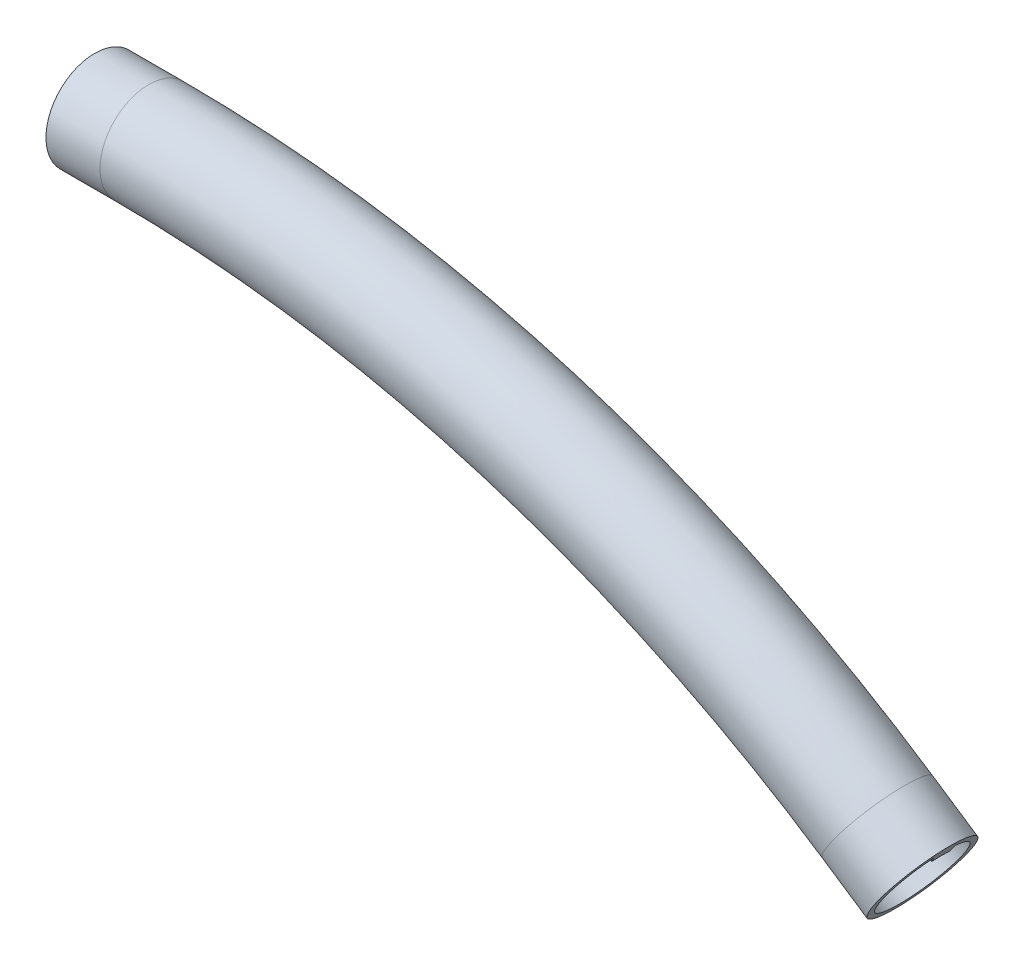
ISO-10303-21;
HEADER;
FILE_DESCRIPTION(('STEP AP214'),'2;1');
FILE_NAME('part.step','',(''),(''),'','','');
FILE_SCHEMA(('AUTOMOTIVE_DESIGN { 1 0 10303 214 1 1 1 1 }'));
ENDSEC;
DATA;
#1=APPLICATION_CONTEXT('core data for automotive mechanical design processes');
#2=APPLICATION_PROTOCOL_DEFINITION('international standard','automotive_design',2000,#1);
#3=PRODUCT_CONTEXT('',#1,'mechanical');
#4=PRODUCT('Part','Part','',(#3));
#5=PRODUCT_RELATED_PRODUCT_CATEGORY('part','',(#4));
#6=PRODUCT_DEFINITION_FORMATION('','',#4);
#7=PRODUCT_DEFINITION_CONTEXT('part definition',#1,'design');
#8=PRODUCT_DEFINITION('design','',#6,#7);
#9=PRODUCT_DEFINITION_SHAPE('','',#8);
#10=(LENGTH_UNIT() NAMED_UNIT(*) SI_UNIT(.MILLI.,.METRE.));
#11=(NAMED_UNIT(*) PLANE_ANGLE_UNIT() SI_UNIT($,.RADIAN.));
#12=(NAMED_UNIT(*) SI_UNIT($,.STERADIAN.) SOLID_ANGLE_UNIT());
#13=UNCERTAINTY_MEASURE_WITH_UNIT(LENGTH_MEASURE(1.E-05),#10,'distance_accuracy_value','');
#14=(GEOMETRIC_REPRESENTATION_CONTEXT(3) GLOBAL_UNCERTAINTY_ASSIGNED_CONTEXT((#13)) GLOBAL_UNIT_ASSIGNED_CONTEXT((#10,
#11,#12)) REPRESENTATION_CONTEXT('',''));
#15=CARTESIAN_POINT('',(0.,0.,0.));
#16=DIRECTION('',(0.,0.,1.));
#17=DIRECTION('',(1.,0.,0.));
#18=AXIS2_PLACEMENT_3D('',#15,#16,#17);
#19=CARTESIAN_POINT('',(10.,100.,0.));
#20=DIRECTION('',(-1.,0.,0.));
#21=DIRECTION('',(0.,0.,1.));
#22=AXIS2_PLACEMENT_3D('',#19,#20,#21);
#23=CYLINDRICAL_SURFACE('',#22,7.75);
#24=CARTESIAN_POINT('',(10.,100.,0.));
#25=DIRECTION('',(1.,0.,0.));
#26=DIRECTION('',(0.,0.,-1.));
#27=AXIS2_PLACEMENT_3D('',#24,#25,#26);
#28=CIRCLE('',#27,7.75);
#29=CARTESIAN_POINT('',(10.,107.75,0.));
#30=VERTEX_POINT('',#29);
#31=EDGE_CURVE('E154',#30,#30,#28,.T.);
#32=ORIENTED_EDGE('',*,*,#31,.T.);
#33=EDGE_LOOP('',(#32));
#34=FACE_BOUND('',#33,.T.);
#35=CARTESIAN_POINT('',(0.,100.,0.));
#36=DIRECTION('',(1.,0.,0.));
#37=DIRECTION('',(0.,0.,-1.));
#38=AXIS2_PLACEMENT_3D('',#35,#36,#37);
#39=CIRCLE('',#38,7.75);
#40=CARTESIAN_POINT('',(0.,107.48592515374,2.00584759954462));
#41=VERTEX_POINT('',#40);
#42=CARTESIAN_POINT('',(0.,107.48592515374,-2.00584759954446));
#43=VERTEX_POINT('',#42);
#44=EDGE_CURVE('E148',#41,#43,#39,.T.);
#45=ORIENTED_EDGE('',*,*,#44,.F.);
#46=DIRECTION('',(-1.,0.,0.));
#47=VECTOR('',#46,1.);
#48=CARTESIAN_POINT('',(5.,107.48592515374,2.00584759954462));
#49=LINE('',#48,#47);
#50=CARTESIAN_POINT('',(5.,107.48592515374,2.00584759954462));
#51=VERTEX_POINT('',#50);
#52=EDGE_CURVE('E325',#51,#41,#49,.T.);
#53=ORIENTED_EDGE('',*,*,#52,.F.);
#54=CARTESIAN_POINT('',(5.,99.9999999999999,0.));
#55=DIRECTION('',(-1.,0.,0.));
#56=DIRECTION('',(0.,0.,1.));
#57=AXIS2_PLACEMENT_3D('',#54,#55,#56);
#58=CIRCLE('',#57,7.75000000000011);
#59=CARTESIAN_POINT('',(5.,107.48592515374,-2.00584759954446));
#60=VERTEX_POINT('',#59);
#61=EDGE_CURVE('E114',#51,#60,#58,.T.);
#62=ORIENTED_EDGE('',*,*,#61,.T.);
#63=DIRECTION('',(-1.,0.,0.));
#64=VECTOR('',#63,1.);
#65=CARTESIAN_POINT('',(5.,107.48592515374,-2.00584759954446));
#66=LINE('',#65,#64);
#67=EDGE_CURVE('E125',#60,#43,#66,.T.);
#68=ORIENTED_EDGE('',*,*,#67,.T.);
#69=EDGE_LOOP('',(#45,#53,#62,#68));
#70=FACE_BOUND('',#69,.T.);
#71=ADVANCED_FACE('F33',(#34,#70),#23,.F.);
#72=CARTESIAN_POINT('',(144.795757594128,59.1101539694819,0.));
#73=DIRECTION('',(0.831469612302545,-0.555570233019603,0.));
#74=DIRECTION('',(0.555570233019603,0.831469612302545,0.));
#75=AXIS2_PLACEMENT_3D('',#72,#73,#74);
#76=CYLINDRICAL_SURFACE('',#75,9.);
#77=CARTESIAN_POINT('',(144.795757594128,59.1101539694819,0.));
#78=DIRECTION('',(0.831469612302544,-0.555570233019603,0.));
#79=DIRECTION('',(0.,0.,-1.));
#80=AXIS2_PLACEMENT_3D('',#77,#78,#79);
#81=CIRCLE('',#80,9.);
#82=CARTESIAN_POINT('',(149.795889691304,66.5933804802048,0.));
#83=VERTEX_POINT('',#82);
#84=EDGE_CURVE('E167',#83,#83,#81,.T.);
#85=ORIENTED_EDGE('',*,*,#84,.T.);
#86=EDGE_LOOP('',(#85));
#87=FACE_BOUND('',#86,.T.);
#88=CARTESIAN_POINT('',(153.110453717153,53.5544516392859,0.));
#89=DIRECTION('',(0.831469612302544,-0.555570233019603,0.));
#90=DIRECTION('',(0.,0.,-1.));
#91=AXIS2_PLACEMENT_3D('',#88,#89,#90);
#92=CIRCLE('',#91,9.);
#93=CARTESIAN_POINT('',(153.110453717153,53.5544516392859,-9.));
#94=VERTEX_POINT('',#93);
#95=EDGE_CURVE('E11',#94,#94,#92,.T.);
#96=ORIENTED_EDGE('',*,*,#95,.F.);
#97=EDGE_LOOP('',(#96));
#98=FACE_BOUND('',#97,.T.);
#99=ADVANCED_FACE('F35',(#87,#98),#76,.T.);
#100=CARTESIAN_POINT('',(144.795757594128,59.1101539694819,0.));
#101=DIRECTION('',(0.831469612302545,-0.555570233019603,0.));
#102=DIRECTION('',(0.555570233019603,0.831469612302545,0.));
#103=AXIS2_PLACEMENT_3D('',#100,#101,#102);
#104=CYLINDRICAL_SURFACE('',#103,7.75);
#105=CARTESIAN_POINT('',(144.795757594128,59.1101539694819,0.));
#106=DIRECTION('',(0.831469612302544,-0.555570233019603,0.));
#107=DIRECTION('',(0.,0.,-1.));
#108=AXIS2_PLACEMENT_3D('',#105,#106,#107);
#109=CIRCLE('',#108,7.75);
#110=CARTESIAN_POINT('',(149.10142690003,65.5540434648267,0.));
#111=VERTEX_POINT('',#110);
#112=EDGE_CURVE('E161',#111,#111,#109,.T.);
#113=ORIENTED_EDGE('',*,*,#112,.F.);
#114=EDGE_LOOP('',(#113));
#115=FACE_BOUND('',#114,.T.);
#116=CARTESIAN_POINT('',(148.953105655641,56.3323028043838,0.));
#117=DIRECTION('',(0.831469612302544,-0.555570233019603,0.));
#118=DIRECTION('',(0.555570233019603,0.831469612302544,0.));
#119=AXIS2_PLACEMENT_3D('',#116,#117,#118);
#120=CIRCLE('',#119,7.75000000000014);
#121=CARTESIAN_POINT('',(153.112062837672,62.5566220896902,-2.00584759954454));
#122=VERTEX_POINT('',#121);
#123=CARTESIAN_POINT('',(153.112062837672,62.5566220896902,2.00584759954455));
#124=VERTEX_POINT('',#123);
#125=EDGE_CURVE('E136',#122,#124,#120,.T.);
#126=ORIENTED_EDGE('',*,*,#125,.T.);
#127=DIRECTION('',(0.831469612302544,-0.555570233019603,0.));
#128=VECTOR('',#127,1.);
#129=CARTESIAN_POINT('',(153.112062837672,62.5566220896902,2.00584759954455));
#130=LINE('',#129,#128);
#131=CARTESIAN_POINT('',(157.269410899184,59.7787709245922,2.00584759954455));
#132=VERTEX_POINT('',#131);
#133=EDGE_CURVE('E149',#124,#132,#130,.T.);
#134=ORIENTED_EDGE('',*,*,#133,.T.);
#135=CARTESIAN_POINT('',(153.110453717153,53.5544516392859,0.));
#136=DIRECTION('',(0.831469612302544,-0.555570233019603,0.));
#137=DIRECTION('',(0.,0.,-1.));
#138=AXIS2_PLACEMENT_3D('',#135,#136,#137);
#139=CIRCLE('',#138,7.75);
#140=CARTESIAN_POINT('',(157.269410899184,59.7787709245922,-2.00584759954454));
#141=VERTEX_POINT('',#140);
#142=EDGE_CURVE('E41',#132,#141,#139,.T.);
#143=ORIENTED_EDGE('',*,*,#142,.T.);
#144=DIRECTION('',(0.831469612302544,-0.555570233019603,0.));
#145=VECTOR('',#144,1.);
#146=CARTESIAN_POINT('',(153.112062837672,62.5566220896902,-2.00584759954454));
#147=LINE('',#146,#145);
#148=EDGE_CURVE('E56',#122,#141,#147,.T.);
#149=ORIENTED_EDGE('',*,*,#148,.F.);
#150=EDGE_LOOP('',(#126,#134,#143,#149));
#151=FACE_BOUND('',#150,.T.);
#152=ADVANCED_FACE('F169',(#115,#151),#104,.F.);
#153=CARTESIAN_POINT('',(10.,-142.62595362875,0.));
#154=DIRECTION('',(0.,0.,-1.));
#155=DIRECTION('',(-1.,0.,0.));
#156=AXIS2_PLACEMENT_3D('',#153,#154,#155);
#157=TOROIDAL_SURFACE('',#156,242.62595362875,9.);
#158=CARTESIAN_POINT('',(10.,100.,0.));
#159=DIRECTION('',(1.,0.,0.));
#160=DIRECTION('',(0.,0.,-1.));
#161=AXIS2_PLACEMENT_3D('',#158,#159,#160);
#162=CIRCLE('',#161,9.);
#163=CARTESIAN_POINT('',(10.,109.,0.));
#164=VERTEX_POINT('',#163);
#165=EDGE_CURVE('E157',#164,#164,#162,.T.);
#166=CARTESIAN_POINT('',(10.,-142.62595362875,0.));
#167=DIRECTION('',(0.,0.,-1.));
#168=DIRECTION('',(-1.,0.,0.));
#169=AXIS2_PLACEMENT_3D('',#166,#167,#168);
#170=CIRCLE('',#169,251.62595362875);
#171=EDGE_CURVE('',#164,#83,#170,.T.);
#172=ORIENTED_EDGE('',*,*,#165,.T.);
#173=ORIENTED_EDGE('',*,*,#84,.F.);
#174=ORIENTED_EDGE('',*,*,#171,.T.);
#175=ORIENTED_EDGE('',*,*,#171,.F.);
#176=EDGE_LOOP('',(#172,#174,#173,#175));
#177=FACE_BOUND('',#176,.T.);
#178=ADVANCED_FACE('F213',(#177),#157,.T.);
#179=CARTESIAN_POINT('',(10.,-142.62595362875,0.));
#180=DIRECTION('',(0.,0.,-1.));
#181=DIRECTION('',(-1.,0.,0.));
#182=AXIS2_PLACEMENT_3D('',#179,#180,#181);
#183=TOROIDAL_SURFACE('',#182,242.62595362875,7.75);
#184=CARTESIAN_POINT('',(10.,-142.62595362875,0.));
#185=DIRECTION('',(0.,0.,-1.));
#186=DIRECTION('',(-1.,0.,0.));
#187=AXIS2_PLACEMENT_3D('',#184,#185,#186);
#188=CIRCLE('',#187,250.37595362875);
#189=EDGE_CURVE('',#30,#111,#188,.T.);
#190=ORIENTED_EDGE('',*,*,#31,.F.);
#191=ORIENTED_EDGE('',*,*,#112,.T.);
#192=ORIENTED_EDGE('',*,*,#189,.T.);
#193=ORIENTED_EDGE('',*,*,#189,.F.);
#194=EDGE_LOOP('',(#190,#192,#191,#193));
#195=FACE_BOUND('',#194,.T.);
#196=ADVANCED_FACE('F210',(#195),#183,.F.);
#197=CARTESIAN_POINT('',(10.,100.,0.));
#198=DIRECTION('',(-1.,0.,0.));
#199=DIRECTION('',(0.,0.,1.));
#200=AXIS2_PLACEMENT_3D('',#197,#198,#199);
#201=CYLINDRICAL_SURFACE('',#200,9.);
#202=ORIENTED_EDGE('',*,*,#165,.F.);
#203=EDGE_LOOP('',(#202));
#204=FACE_BOUND('',#203,.T.);
#205=CARTESIAN_POINT('',(0.,100.,0.));
#206=DIRECTION('',(1.,0.,0.));
#207=DIRECTION('',(0.,0.,-1.));
#208=AXIS2_PLACEMENT_3D('',#205,#206,#207);
#209=CIRCLE('',#208,9.);
#210=CARTESIAN_POINT('',(0.,100.,-9.));
#211=VERTEX_POINT('',#210);
#212=EDGE_CURVE('E158',#211,#211,#209,.T.);
#213=ORIENTED_EDGE('',*,*,#212,.T.);
#214=EDGE_LOOP('',(#213));
#215=FACE_BOUND('',#214,.T.);
#216=ADVANCED_FACE('F208',(#204,#215),#201,.T.);
#217=CARTESIAN_POINT('',(153.110453717153,53.5544516392859,0.));
#218=DIRECTION('',(0.831469612302544,-0.555570233019603,0.));
#219=DIRECTION('',(0.,0.,-1.));
#220=AXIS2_PLACEMENT_3D('',#217,#218,#219);
#221=PLANE('',#220);
#222=ORIENTED_EDGE('',*,*,#142,.F.);
#223=DIRECTION('',(-0.536639636391071,-0.803137972297589,-0.258819045102514));
#224=VECTOR('',#223,1.);
#225=CARTESIAN_POINT('',(156.464451444598,58.5740639661458,1.61761903189077));
#226=LINE('',#225,#224);
#227=CARTESIAN_POINT('',(156.464451444598,58.5740639661458,1.61761903189077));
#228=VERTEX_POINT('',#227);
#229=EDGE_CURVE('E133',#132,#228,#226,.T.);
#230=ORIENTED_EDGE('',*,*,#229,.T.);
#231=CARTESIAN_POINT('',(153.110453717153,53.5544516392858,0.));
#232=DIRECTION('',(-0.831469612302544,0.555570233019603,0.));
#233=DIRECTION('',(0.555570233019603,0.831469612302544,0.));
#234=AXIS2_PLACEMENT_3D('',#231,#232,#233);
#235=CIRCLE('',#234,6.25000000000013);
#236=CARTESIAN_POINT('',(156.464451444598,58.5740639661458,-1.61761903189077));
#237=VERTEX_POINT('',#236);
#238=EDGE_CURVE('E120',#228,#237,#235,.T.);
#239=ORIENTED_EDGE('',*,*,#238,.T.);
#240=DIRECTION('',(0.53663963639107,0.803137972297588,-0.258819045102518));
#241=VECTOR('',#240,1.);
#242=CARTESIAN_POINT('',(157.269410899184,59.7787709245922,-2.00584759954455));
#243=LINE('',#242,#241);
#244=EDGE_CURVE('E123',#237,#141,#243,.T.);
#245=ORIENTED_EDGE('',*,*,#244,.T.);
#246=EDGE_LOOP('',(#222,#230,#239,#245));
#247=FACE_BOUND('',#246,.T.);
#248=ORIENTED_EDGE('',*,*,#95,.T.);
#249=EDGE_LOOP('',(#248));
#250=FACE_BOUND('',#249,.T.);
#251=ADVANCED_FACE('F177',(#247,#250),#221,.T.);
#252=CARTESIAN_POINT('',(0.,100.,0.));
#253=DIRECTION('',(1.,0.,0.));
#254=DIRECTION('',(0.,0.,-1.));
#255=AXIS2_PLACEMENT_3D('',#252,#253,#254);
#256=PLANE('',#255);
#257=ORIENTED_EDGE('',*,*,#44,.T.);
#258=DIRECTION('',(0.,0.96592582628907,-0.258819045102515));
#259=VECTOR('',#258,1.);
#260=CARTESIAN_POINT('',(0.,106.037036414307,-1.61761903189069));
#261=LINE('',#260,#259);
#262=CARTESIAN_POINT('',(0.,106.037036414307,-1.61761903189069));
#263=VERTEX_POINT('',#262);
#264=EDGE_CURVE('E117',#263,#43,#261,.T.);
#265=ORIENTED_EDGE('',*,*,#264,.F.);
#266=CARTESIAN_POINT('',(0.,99.9999999999999,0.));
#267=DIRECTION('',(-1.,0.,0.));
#268=DIRECTION('',(0.,0.,1.));
#269=AXIS2_PLACEMENT_3D('',#266,#267,#268);
#270=CIRCLE('',#269,6.25000000000009);
#271=CARTESIAN_POINT('',(0.,106.037036414307,1.61761903189083));
#272=VERTEX_POINT('',#271);
#273=EDGE_CURVE('E322',#272,#263,#270,.T.);
#274=ORIENTED_EDGE('',*,*,#273,.F.);
#275=DIRECTION('',(0.,-0.965925826289069,-0.25881904510252));
#276=VECTOR('',#275,1.);
#277=CARTESIAN_POINT('',(0.,107.48592515374,2.00584759954462));
#278=LINE('',#277,#276);
#279=EDGE_CURVE('E48',#41,#272,#278,.T.);
#280=ORIENTED_EDGE('',*,*,#279,.F.);
#281=EDGE_LOOP('',(#257,#265,#274,#280));
#282=FACE_BOUND('',#281,.T.);
#283=ORIENTED_EDGE('',*,*,#212,.F.);
#284=EDGE_LOOP('',(#283));
#285=FACE_BOUND('',#284,.T.);
#286=ADVANCED_FACE('F195',(#282,#285),#256,.F.);
#287=CARTESIAN_POINT('',(148.953105655641,56.3323028043838,0.));
#288=DIRECTION('',(0.831469612302544,-0.555570233019603,0.));
#289=DIRECTION('',(0.555570233019604,0.831469612302545,0.));
#290=AXIS2_PLACEMENT_3D('',#287,#288,#289);
#291=CYLINDRICAL_SURFACE('',#290,6.25000000000013);
#292=ORIENTED_EDGE('',*,*,#238,.F.);
#293=DIRECTION('',(0.831469612302544,-0.555570233019603,0.));
#294=VECTOR('',#293,1.);
#295=CARTESIAN_POINT('',(152.307103383085,61.3519151312438,1.61761903189077));
#296=LINE('',#295,#294);
#297=CARTESIAN_POINT('',(152.307103383085,61.3519151312438,1.61761903189077));
#298=VERTEX_POINT('',#297);
#299=EDGE_CURVE('E146',#298,#228,#296,.T.);
#300=ORIENTED_EDGE('',*,*,#299,.F.);
#301=CARTESIAN_POINT('',(148.953105655641,56.3323028043838,0.));
#302=DIRECTION('',(-0.831469612302544,0.555570233019603,0.));
#303=DIRECTION('',(0.555570233019603,0.831469612302544,0.));
#304=AXIS2_PLACEMENT_3D('',#301,#302,#303);
#305=CIRCLE('',#304,6.25000000000013);
#306=CARTESIAN_POINT('',(152.307103383085,61.3519151312438,-1.61761903189077));
#307=VERTEX_POINT('',#306);
#308=EDGE_CURVE('E129',#298,#307,#305,.T.);
#309=ORIENTED_EDGE('',*,*,#308,.T.);
#310=DIRECTION('',(0.831469612302544,-0.555570233019603,0.));
#311=VECTOR('',#310,1.);
#312=CARTESIAN_POINT('',(152.307103383085,61.3519151312438,-1.61761903189077));
#313=LINE('',#312,#311);
#314=EDGE_CURVE('E140',#307,#237,#313,.T.);
#315=ORIENTED_EDGE('',*,*,#314,.T.);
#316=EDGE_LOOP('',(#292,#300,#309,#315));
#317=FACE_BOUND('',#316,.T.);
#318=ADVANCED_FACE('F181',(#317),#291,.F.);
#319=CARTESIAN_POINT('',(152.307103383085,61.3519151312438,1.61761903189077));
#320=DIRECTION('',(-0.143792157197515,-0.215200171087902,0.96592582628907));
#321=DIRECTION('',(0.,-0.976069225530008,-0.217460035347303));
#322=AXIS2_PLACEMENT_3D('',#319,#320,#321);
#323=PLANE('',#322);
#324=ORIENTED_EDGE('',*,*,#229,.F.);
#325=ORIENTED_EDGE('',*,*,#133,.F.);
#326=DIRECTION('',(-0.536639636391071,-0.803137972297589,-0.258819045102514));
#327=VECTOR('',#326,1.);
#328=CARTESIAN_POINT('',(152.307103383085,61.3519151312438,1.61761903189077));
#329=LINE('',#328,#327);
#330=EDGE_CURVE('E138',#124,#298,#329,.T.);
#331=ORIENTED_EDGE('',*,*,#330,.T.);
#332=ORIENTED_EDGE('',*,*,#299,.T.);
#333=EDGE_LOOP('',(#324,#325,#331,#332));
#334=FACE_BOUND('',#333,.T.);
#335=ADVANCED_FACE('F187',(#334),#323,.T.);
#336=CARTESIAN_POINT('',(153.112062837672,62.5566220896902,-2.00584759954455));
#337=DIRECTION('',(-0.143792157197517,-0.215200171087905,-0.965925826289069));
#338=DIRECTION('',(0.,0.976069225530007,-0.217460035347306));
#339=AXIS2_PLACEMENT_3D('',#336,#337,#338);
#340=PLANE('',#339);
#341=ORIENTED_EDGE('',*,*,#244,.F.);
#342=ORIENTED_EDGE('',*,*,#314,.F.);
#343=DIRECTION('',(0.53663963639107,0.803137972297588,-0.258819045102518));
#344=VECTOR('',#343,1.);
#345=CARTESIAN_POINT('',(153.112062837672,62.5566220896902,-2.00584759954455));
#346=LINE('',#345,#344);
#347=EDGE_CURVE('E132',#307,#122,#346,.T.);
#348=ORIENTED_EDGE('',*,*,#347,.T.);
#349=ORIENTED_EDGE('',*,*,#148,.T.);
#350=EDGE_LOOP('',(#341,#342,#348,#349));
#351=FACE_BOUND('',#350,.T.);
#352=ADVANCED_FACE('F175',(#351),#340,.T.);
#353=CARTESIAN_POINT('',(148.953105655641,56.3323028043838,0.));
#354=DIRECTION('',(0.831469612302544,-0.555570233019603,0.));
#355=DIRECTION('',(0.555570233019603,0.831469612302544,0.));
#356=AXIS2_PLACEMENT_3D('',#353,#354,#355);
#357=PLANE('',#356);
#358=ORIENTED_EDGE('',*,*,#308,.F.);
#359=ORIENTED_EDGE('',*,*,#330,.F.);
#360=ORIENTED_EDGE('',*,*,#125,.F.);
#361=ORIENTED_EDGE('',*,*,#347,.F.);
#362=EDGE_LOOP('',(#358,#359,#360,#361));
#363=FACE_BOUND('',#362,.T.);
#364=ADVANCED_FACE('F184',(#363),#357,.F.);
#365=CARTESIAN_POINT('',(5.,107.48592515374,2.00584759954462));
#366=DIRECTION('',(0.,0.25881904510252,-0.965925826289069));
#367=DIRECTION('',(0.,0.965925826289069,0.25881904510252));
#368=AXIS2_PLACEMENT_3D('',#365,#366,#367);
#369=PLANE('',#368);
#370=ORIENTED_EDGE('',*,*,#279,.T.);
#371=DIRECTION('',(-1.,0.,0.));
#372=VECTOR('',#371,1.);
#373=CARTESIAN_POINT('',(5.,106.037036414307,1.61761903189083));
#374=LINE('',#373,#372);
#375=CARTESIAN_POINT('',(5.,106.037036414307,1.61761903189083));
#376=VERTEX_POINT('',#375);
#377=EDGE_CURVE('E103',#376,#272,#374,.T.);
#378=ORIENTED_EDGE('',*,*,#377,.F.);
#379=DIRECTION('',(0.,-0.965925826289069,-0.25881904510252));
#380=VECTOR('',#379,1.);
#381=CARTESIAN_POINT('',(5.,107.48592515374,2.00584759954462));
#382=LINE('',#381,#380);
#383=EDGE_CURVE('E109',#51,#376,#382,.T.);
#384=ORIENTED_EDGE('',*,*,#383,.F.);
#385=ORIENTED_EDGE('',*,*,#52,.T.);
#386=EDGE_LOOP('',(#370,#378,#384,#385));
#387=FACE_BOUND('',#386,.T.);
#388=ADVANCED_FACE('F119',(#387),#369,.F.);
#389=CARTESIAN_POINT('',(5.,99.9999999999999,0.));
#390=DIRECTION('',(-1.,0.,0.));
#391=DIRECTION('',(0.,0.,1.));
#392=AXIS2_PLACEMENT_3D('',#389,#390,#391);
#393=CYLINDRICAL_SURFACE('',#392,6.25000000000009);
#394=ORIENTED_EDGE('',*,*,#273,.T.);
#395=DIRECTION('',(-1.,0.,0.));
#396=VECTOR('',#395,1.);
#397=CARTESIAN_POINT('',(5.,106.037036414307,-1.61761903189069));
#398=LINE('',#397,#396);
#399=CARTESIAN_POINT('',(5.,106.037036414307,-1.61761903189069));
#400=VERTEX_POINT('',#399);
#401=EDGE_CURVE('E105',#400,#263,#398,.T.);
#402=ORIENTED_EDGE('',*,*,#401,.F.);
#403=CARTESIAN_POINT('',(5.,99.9999999999999,0.));
#404=DIRECTION('',(-1.,0.,0.));
#405=DIRECTION('',(0.,0.,1.));
#406=AXIS2_PLACEMENT_3D('',#403,#404,#405);
#407=CIRCLE('',#406,6.25000000000009);
#408=EDGE_CURVE('E99',#376,#400,#407,.T.);
#409=ORIENTED_EDGE('',*,*,#408,.F.);
#410=ORIENTED_EDGE('',*,*,#377,.T.);
#411=EDGE_LOOP('',(#394,#402,#409,#410));
#412=FACE_BOUND('',#411,.T.);
#413=ADVANCED_FACE('F101',(#412),#393,.F.);
#414=CARTESIAN_POINT('',(5.,106.037036414307,-1.61761903189069));
#415=DIRECTION('',(0.,0.258819045102515,0.96592582628907));
#416=DIRECTION('',(0.,-0.96592582628907,0.258819045102515));
#417=AXIS2_PLACEMENT_3D('',#414,#415,#416);
#418=PLANE('',#417);
#419=ORIENTED_EDGE('',*,*,#264,.T.);
#420=ORIENTED_EDGE('',*,*,#67,.F.);
#421=DIRECTION('',(0.,0.96592582628907,-0.258819045102515));
#422=VECTOR('',#421,1.);
#423=CARTESIAN_POINT('',(5.,106.037036414307,-1.61761903189069));
#424=LINE('',#423,#422);
#425=EDGE_CURVE('E108',#400,#60,#424,.T.);
#426=ORIENTED_EDGE('',*,*,#425,.F.);
#427=ORIENTED_EDGE('',*,*,#401,.T.);
#428=EDGE_LOOP('',(#419,#420,#426,#427));
#429=FACE_BOUND('',#428,.T.);
#430=ADVANCED_FACE('F298',(#429),#418,.F.);
#431=CARTESIAN_POINT('',(5.,99.9999999999999,0.));
#432=DIRECTION('',(-1.,0.,0.));
#433=DIRECTION('',(0.,0.,1.));
#434=AXIS2_PLACEMENT_3D('',#431,#432,#433);
#435=PLANE('',#434);
#436=ORIENTED_EDGE('',*,*,#383,.T.);
#437=ORIENTED_EDGE('',*,*,#408,.T.);
#438=ORIENTED_EDGE('',*,*,#425,.T.);
#439=ORIENTED_EDGE('',*,*,#61,.F.);
#440=EDGE_LOOP('',(#436,#437,#438,#439));
#441=FACE_BOUND('',#440,.T.);
#442=ADVANCED_FACE('F112',(#441),#435,.F.);
#443=CLOSED_SHELL('',(#71,#99,#152,#178,#196,#216,#251,#286,#318,#335,#352,#364,#388,#413,#430,#442));
#444=MANIFOLD_SOLID_BREP('B2',#443);
#445=ADVANCED_BREP_SHAPE_REPRESENTATION('',(#18,#444),#14);
#446=SHAPE_DEFINITION_REPRESENTATION(#9,#445);
ENDSEC;
END-ISO-10303-21;
